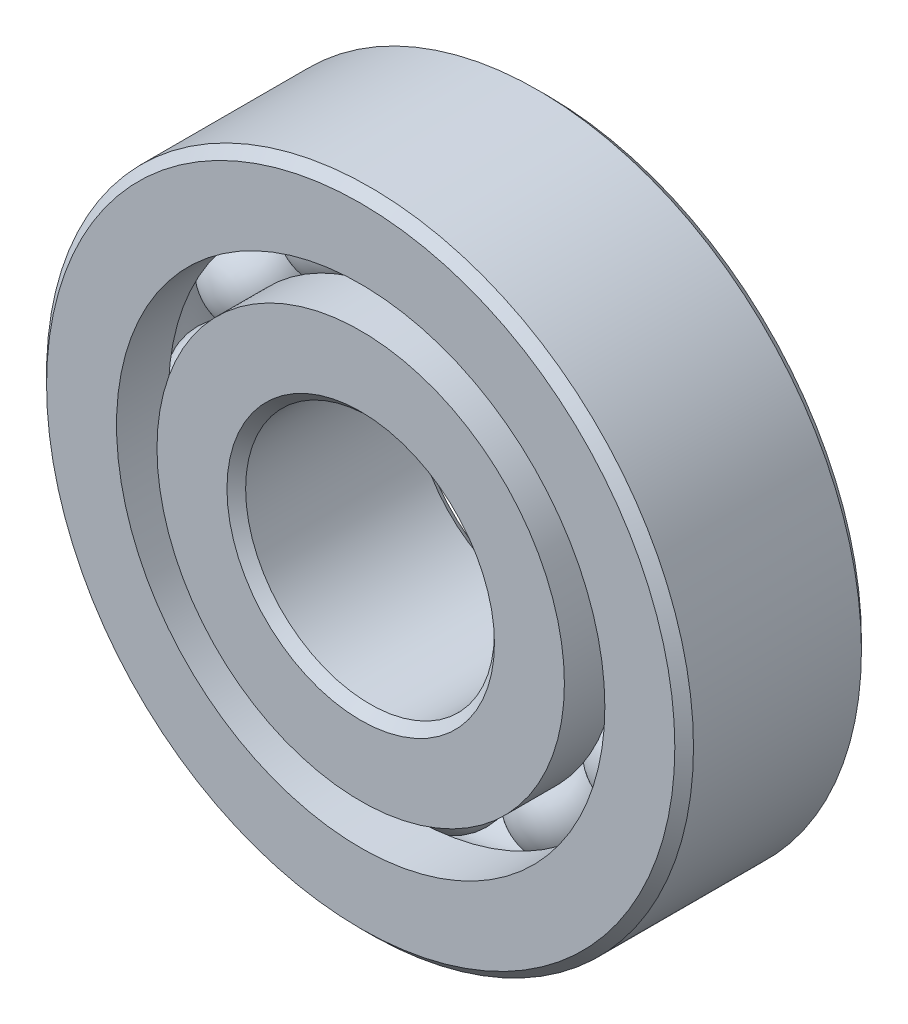
ISO-10303-21;
HEADER;
FILE_DESCRIPTION(('STEP AP214'),'2;1');
FILE_NAME('part.step','',(''),(''),'','','');
FILE_SCHEMA(('AUTOMOTIVE_DESIGN { 1 0 10303 214 1 1 1 1 }'));
ENDSEC;
DATA;
#1=APPLICATION_CONTEXT('core data for automotive mechanical design processes');
#2=APPLICATION_PROTOCOL_DEFINITION('international standard','automotive_design',2000,#1);
#3=PRODUCT_CONTEXT('',#1,'mechanical');
#4=PRODUCT('Part','Part','',(#3));
#5=PRODUCT_RELATED_PRODUCT_CATEGORY('part','',(#4));
#6=PRODUCT_DEFINITION_FORMATION('','',#4);
#7=PRODUCT_DEFINITION_CONTEXT('part definition',#1,'design');
#8=PRODUCT_DEFINITION('design','',#6,#7);
#9=PRODUCT_DEFINITION_SHAPE('','',#8);
#10=(LENGTH_UNIT() NAMED_UNIT(*) SI_UNIT(.MILLI.,.METRE.));
#11=(NAMED_UNIT(*) PLANE_ANGLE_UNIT() SI_UNIT($,.RADIAN.));
#12=(NAMED_UNIT(*) SI_UNIT($,.STERADIAN.) SOLID_ANGLE_UNIT());
#13=UNCERTAINTY_MEASURE_WITH_UNIT(LENGTH_MEASURE(1.E-05),#10,'distance_accuracy_value','');
#14=(GEOMETRIC_REPRESENTATION_CONTEXT(3) GLOBAL_UNCERTAINTY_ASSIGNED_CONTEXT((#13)) GLOBAL_UNIT_ASSIGNED_CONTEXT((#10,
#11,#12)) REPRESENTATION_CONTEXT('',''));
#15=CARTESIAN_POINT('',(0.,0.,0.));
#16=DIRECTION('',(0.,0.,1.));
#17=DIRECTION('',(1.,0.,0.));
#18=AXIS2_PLACEMENT_3D('',#15,#16,#17);
#19=CARTESIAN_POINT('',(-8.9999999999998,15.58845726812,0.));
#20=DIRECTION('',(0.,0.,1.));
#21=DIRECTION('',(-0.499999999999989,0.866025403784445,0.));
#22=AXIS2_PLACEMENT_3D('',#19,#20,#21);
#23=SPHERICAL_SURFACE('',#22,3.70893546501888);
#24=CARTESIAN_POINT('',(-8.9999999999998,15.58845726812,3.70893546501888));
#25=VERTEX_POINT('',#24);
#26=VERTEX_LOOP('',#25);
#27=FACE_BOUND('',#26,.T.);
#28=ADVANCED_FACE('F36',(#27),#23,.T.);
#29=CLOSED_SHELL('',(#28));
#30=MANIFOLD_SOLID_BREP('B2',#29);
#31=CARTESIAN_POINT('',(-15.5884572681198,9.00000000000018,0.));
#32=DIRECTION('',(0.,0.,1.));
#33=DIRECTION('',(-0.866025403784433,0.50000000000001,0.));
#34=AXIS2_PLACEMENT_3D('',#31,#32,#33);
#35=SPHERICAL_SURFACE('',#34,3.70893546501888);
#36=CARTESIAN_POINT('',(-15.5884572681198,9.00000000000018,3.70893546501888));
#37=VERTEX_POINT('',#36);
#38=VERTEX_LOOP('',#37);
#39=FACE_BOUND('',#38,.T.);
#40=ADVANCED_FACE('F57',(#39),#35,.T.);
#41=CLOSED_SHELL('',(#40));
#42=MANIFOLD_SOLID_BREP('B6',#41);
#43=CARTESIAN_POINT('',(-18.,1.88539992297529E-13,0.));
#44=DIRECTION('',(0.,0.,1.));
#45=DIRECTION('',(-1.,0.,0.));
#46=AXIS2_PLACEMENT_3D('',#43,#44,#45);
#47=SPHERICAL_SURFACE('',#46,3.70893546501888);
#48=CARTESIAN_POINT('',(-18.,1.88539992297529E-13,3.70893546501888));
#49=VERTEX_POINT('',#48);
#50=VERTEX_LOOP('',#49);
#51=FACE_BOUND('',#50,.T.);
#52=ADVANCED_FACE('F78',(#51),#47,.T.);
#53=CLOSED_SHELL('',(#52));
#54=MANIFOLD_SOLID_BREP('B32',#53);
#55=CARTESIAN_POINT('',(-15.58845726812,-8.99999999999985,0.));
#56=DIRECTION('',(0.,0.,1.));
#57=DIRECTION('',(-0.866025403784443,-0.499999999999992,0.));
#58=AXIS2_PLACEMENT_3D('',#55,#56,#57);
#59=SPHERICAL_SURFACE('',#58,3.70893546501888);
#60=CARTESIAN_POINT('',(-15.58845726812,-8.99999999999985,3.70893546501888));
#61=VERTEX_POINT('',#60);
#62=VERTEX_LOOP('',#61);
#63=FACE_BOUND('',#62,.T.);
#64=ADVANCED_FACE('F99',(#63),#59,.T.);
#65=CLOSED_SHELL('',(#64));
#66=MANIFOLD_SOLID_BREP('B53',#65);
#67=CARTESIAN_POINT('',(-9.00000000000013,-15.5884572681198,0.));
#68=DIRECTION('',(0.,0.,1.));
#69=DIRECTION('',(-0.500000000000007,-0.866025403784435,0.));
#70=AXIS2_PLACEMENT_3D('',#67,#68,#69);
#71=SPHERICAL_SURFACE('',#70,3.70893546501888);
#72=CARTESIAN_POINT('',(-9.00000000000013,-15.5884572681198,3.70893546501888));
#73=VERTEX_POINT('',#72);
#74=VERTEX_LOOP('',#73);
#75=FACE_BOUND('',#74,.T.);
#76=ADVANCED_FACE('F120',(#75),#71,.T.);
#77=CLOSED_SHELL('',(#76));
#78=MANIFOLD_SOLID_BREP('B74',#77);
#79=CARTESIAN_POINT('',(-1.25693328198353E-13,-18.,0.));
#80=DIRECTION('',(0.,0.,1.));
#81=DIRECTION('',(0.,-1.,0.));
#82=AXIS2_PLACEMENT_3D('',#79,#80,#81);
#83=SPHERICAL_SURFACE('',#82,3.70893546501888);
#84=CARTESIAN_POINT('',(-1.25693328198353E-13,-18.,3.70893546501888));
#85=VERTEX_POINT('',#84);
#86=VERTEX_LOOP('',#85);
#87=FACE_BOUND('',#86,.T.);
#88=ADVANCED_FACE('F141',(#87),#83,.T.);
#89=CLOSED_SHELL('',(#88));
#90=MANIFOLD_SOLID_BREP('B95',#89);
#91=CARTESIAN_POINT('',(8.99999999999991,-15.5884572681199,0.));
#92=DIRECTION('',(0.,0.,1.));
#93=DIRECTION('',(0.499999999999995,-0.866025403784442,0.));
#94=AXIS2_PLACEMENT_3D('',#91,#92,#93);
#95=SPHERICAL_SURFACE('',#94,3.70893546501888);
#96=CARTESIAN_POINT('',(8.99999999999991,-15.5884572681199,3.70893546501888));
#97=VERTEX_POINT('',#96);
#98=VERTEX_LOOP('',#97);
#99=FACE_BOUND('',#98,.T.);
#100=ADVANCED_FACE('F162',(#99),#95,.T.);
#101=CLOSED_SHELL('',(#100));
#102=MANIFOLD_SOLID_BREP('B116',#101);
#103=CARTESIAN_POINT('',(15.5884572681199,-9.00000000000007,0.));
#104=DIRECTION('',(0.,0.,1.));
#105=DIRECTION('',(0.866025403784436,-0.500000000000004,0.));
#106=AXIS2_PLACEMENT_3D('',#103,#104,#105);
#107=SPHERICAL_SURFACE('',#106,3.70893546501888);
#108=CARTESIAN_POINT('',(15.5884572681199,-9.00000000000007,3.70893546501888));
#109=VERTEX_POINT('',#108);
#110=VERTEX_LOOP('',#109);
#111=FACE_BOUND('',#110,.T.);
#112=ADVANCED_FACE('F183',(#111),#107,.T.);
#113=CLOSED_SHELL('',(#112));
#114=MANIFOLD_SOLID_BREP('B137',#113);
#115=CARTESIAN_POINT('',(18.,0.,0.));
#116=DIRECTION('',(0.,0.,1.));
#117=DIRECTION('',(1.,0.,0.));
#118=AXIS2_PLACEMENT_3D('',#115,#116,#117);
#119=SPHERICAL_SURFACE('',#118,3.70893546501888);
#120=CARTESIAN_POINT('',(18.,0.,3.70893546501888));
#121=VERTEX_POINT('',#120);
#122=VERTEX_LOOP('',#121);
#123=FACE_BOUND('',#122,.T.);
#124=ADVANCED_FACE('F204',(#123),#119,.T.);
#125=CLOSED_SHELL('',(#124));
#126=MANIFOLD_SOLID_BREP('B158',#125);
#127=CARTESIAN_POINT('',(15.5884572681199,8.99999999999996,0.));
#128=DIRECTION('',(0.,0.,1.));
#129=DIRECTION('',(0.86602540378444,0.499999999999998,0.));
#130=AXIS2_PLACEMENT_3D('',#127,#128,#129);
#131=SPHERICAL_SURFACE('',#130,3.70893546501888);
#132=CARTESIAN_POINT('',(15.5884572681199,8.99999999999996,3.70893546501888));
#133=VERTEX_POINT('',#132);
#134=VERTEX_LOOP('',#133);
#135=FACE_BOUND('',#134,.T.);
#136=ADVANCED_FACE('F225',(#135),#131,.T.);
#137=CLOSED_SHELL('',(#136));
#138=MANIFOLD_SOLID_BREP('B179',#137);
#139=CARTESIAN_POINT('',(9.00000000000002,15.5884572681199,0.));
#140=DIRECTION('',(0.,0.,1.));
#141=DIRECTION('',(0.500000000000001,0.866025403784438,0.));
#142=AXIS2_PLACEMENT_3D('',#139,#140,#141);
#143=SPHERICAL_SURFACE('',#142,3.70893546501888);
#144=CARTESIAN_POINT('',(9.00000000000002,15.5884572681199,3.70893546501888));
#145=VERTEX_POINT('',#144);
#146=VERTEX_LOOP('',#145);
#147=FACE_BOUND('',#146,.T.);
#148=ADVANCED_FACE('F246',(#147),#143,.T.);
#149=CLOSED_SHELL('',(#148));
#150=MANIFOLD_SOLID_BREP('B200',#149);
#151=CARTESIAN_POINT('',(0.,18.,0.));
#152=DIRECTION('',(0.,0.,1.));
#153=DIRECTION('',(0.,1.,0.));
#154=AXIS2_PLACEMENT_3D('',#151,#152,#153);
#155=SPHERICAL_SURFACE('',#154,3.70893546501888);
#156=CARTESIAN_POINT('',(0.,18.,3.70893546501888));
#157=VERTEX_POINT('',#156);
#158=VERTEX_LOOP('',#157);
#159=FACE_BOUND('',#158,.T.);
#160=ADVANCED_FACE('F269',(#159),#155,.T.);
#161=CLOSED_SHELL('',(#160));
#162=MANIFOLD_SOLID_BREP('B221',#161);
#163=CARTESIAN_POINT('',(0.,16.3736263736264,7.5));
#164=DIRECTION('',(0.,0.,-1.));
#165=DIRECTION('',(-1.,0.,0.));
#166=AXIS2_PLACEMENT_3D('',#163,#164,#165);
#167=PLANE('',#166);
#168=CARTESIAN_POINT('',(0.,0.,7.5));
#169=DIRECTION('',(0.,0.,1.));
#170=DIRECTION('',(1.,0.,0.));
#171=AXIS2_PLACEMENT_3D('',#168,#169,#170);
#172=CIRCLE('',#171,10.75);
#173=CARTESIAN_POINT('',(10.75,0.,7.5));
#174=VERTEX_POINT('',#173);
#175=EDGE_CURVE('E317',#174,#174,#172,.T.);
#176=ORIENTED_EDGE('',*,*,#175,.F.);
#177=EDGE_LOOP('',(#176));
#178=FACE_BOUND('',#177,.T.);
#179=CARTESIAN_POINT('',(0.,0.,7.5));
#180=DIRECTION('',(0.,0.,1.));
#181=DIRECTION('',(1.,0.,0.));
#182=AXIS2_PLACEMENT_3D('',#179,#180,#181);
#183=CIRCLE('',#182,16.3736263736264);
#184=CARTESIAN_POINT('',(16.3736263736264,0.,7.5));
#185=VERTEX_POINT('',#184);
#186=EDGE_CURVE('E268',#185,#185,#183,.T.);
#187=ORIENTED_EDGE('',*,*,#186,.T.);
#188=EDGE_LOOP('',(#187));
#189=FACE_BOUND('',#188,.T.);
#190=ADVANCED_FACE('F289',(#178,#189),#167,.F.);
#191=CARTESIAN_POINT('',(0.,0.,7.5));
#192=DIRECTION('',(0.,0.,1.));
#193=DIRECTION('',(1.,0.,0.));
#194=AXIS2_PLACEMENT_3D('',#191,#192,#193);
#195=CYLINDRICAL_SURFACE('',#194,16.3736263736264);
#196=ORIENTED_EDGE('',*,*,#186,.F.);
#197=EDGE_LOOP('',(#196));
#198=FACE_BOUND('',#197,.T.);
#199=CARTESIAN_POINT('',(0.,0.,3.33333333333333));
#200=DIRECTION('',(0.,0.,1.));
#201=DIRECTION('',(1.,0.,0.));
#202=AXIS2_PLACEMENT_3D('',#199,#200,#201);
#203=CIRCLE('',#202,16.3736263736264);
#204=CARTESIAN_POINT('',(16.3736263736264,0.,3.33333333333333));
#205=VERTEX_POINT('',#204);
#206=EDGE_CURVE('E295',#205,#205,#203,.T.);
#207=ORIENTED_EDGE('',*,*,#206,.T.);
#208=EDGE_LOOP('',(#207));
#209=FACE_BOUND('',#208,.T.);
#210=ADVANCED_FACE('F324',(#198,#209),#195,.T.);
#211=CARTESIAN_POINT('',(0.,0.,0.));
#212=DIRECTION('',(0.,0.,1.));
#213=DIRECTION('',(1.,0.,0.));
#214=AXIS2_PLACEMENT_3D('',#211,#212,#213);
#215=TOROIDAL_SURFACE('',#214,18.,3.70893546501887);
#216=ORIENTED_EDGE('',*,*,#206,.F.);
#217=EDGE_LOOP('',(#216));
#218=FACE_BOUND('',#217,.T.);
#219=CARTESIAN_POINT('',(0.,0.,-3.33333333333334));
#220=DIRECTION('',(0.,0.,1.));
#221=DIRECTION('',(1.,0.,0.));
#222=AXIS2_PLACEMENT_3D('',#219,#220,#221);
#223=CIRCLE('',#222,16.3736263736264);
#224=CARTESIAN_POINT('',(16.3736263736264,0.,-3.33333333333334));
#225=VERTEX_POINT('',#224);
#226=EDGE_CURVE('E299',#225,#225,#223,.T.);
#227=ORIENTED_EDGE('',*,*,#226,.T.);
#228=EDGE_LOOP('',(#227));
#229=FACE_BOUND('',#228,.T.);
#230=ADVANCED_FACE('F328',(#218,#229),#215,.F.);
#231=CARTESIAN_POINT('',(0.,0.,7.5));
#232=DIRECTION('',(0.,0.,1.));
#233=DIRECTION('',(1.,0.,0.));
#234=AXIS2_PLACEMENT_3D('',#231,#232,#233);
#235=CYLINDRICAL_SURFACE('',#234,16.3736263736264);
#236=ORIENTED_EDGE('',*,*,#226,.F.);
#237=EDGE_LOOP('',(#236));
#238=FACE_BOUND('',#237,.T.);
#239=CARTESIAN_POINT('',(0.,0.,-7.5));
#240=DIRECTION('',(0.,0.,1.));
#241=DIRECTION('',(1.,0.,0.));
#242=AXIS2_PLACEMENT_3D('',#239,#240,#241);
#243=CIRCLE('',#242,16.3736263736264);
#244=CARTESIAN_POINT('',(16.3736263736264,0.,-7.5));
#245=VERTEX_POINT('',#244);
#246=EDGE_CURVE('E303',#245,#245,#243,.T.);
#247=ORIENTED_EDGE('',*,*,#246,.T.);
#248=EDGE_LOOP('',(#247));
#249=FACE_BOUND('',#248,.T.);
#250=ADVANCED_FACE('F333',(#238,#249),#235,.T.);
#251=CARTESIAN_POINT('',(0.,10.75,-7.5));
#252=DIRECTION('',(0.,0.,1.));
#253=DIRECTION('',(1.,0.,0.));
#254=AXIS2_PLACEMENT_3D('',#251,#252,#253);
#255=PLANE('',#254);
#256=ORIENTED_EDGE('',*,*,#246,.F.);
#257=EDGE_LOOP('',(#256));
#258=FACE_BOUND('',#257,.T.);
#259=CARTESIAN_POINT('',(0.,0.,-7.5));
#260=DIRECTION('',(0.,0.,1.));
#261=DIRECTION('',(1.,0.,0.));
#262=AXIS2_PLACEMENT_3D('',#259,#260,#261);
#263=CIRCLE('',#262,10.75);
#264=CARTESIAN_POINT('',(10.75,0.,-7.5));
#265=VERTEX_POINT('',#264);
#266=EDGE_CURVE('E308',#265,#265,#263,.T.);
#267=ORIENTED_EDGE('',*,*,#266,.T.);
#268=EDGE_LOOP('',(#267));
#269=FACE_BOUND('',#268,.T.);
#270=ADVANCED_FACE('F339',(#258,#269),#255,.F.);
#271=CARTESIAN_POINT('',(0.,0.,-6.75));
#272=DIRECTION('',(0.,0.,-1.));
#273=DIRECTION('',(-1.,0.,0.));
#274=AXIS2_PLACEMENT_3D('',#271,#272,#273);
#275=CONICAL_SURFACE('',#274,10.,0.785398163397445);
#276=ORIENTED_EDGE('',*,*,#266,.F.);
#277=EDGE_LOOP('',(#276));
#278=FACE_BOUND('',#277,.T.);
#279=CARTESIAN_POINT('',(0.,0.,-6.75));
#280=DIRECTION('',(0.,0.,1.));
#281=DIRECTION('',(1.,0.,0.));
#282=AXIS2_PLACEMENT_3D('',#279,#280,#281);
#283=CIRCLE('',#282,10.);
#284=CARTESIAN_POINT('',(10.,0.,-6.75));
#285=VERTEX_POINT('',#284);
#286=EDGE_CURVE('E311',#285,#285,#283,.T.);
#287=ORIENTED_EDGE('',*,*,#286,.T.);
#288=EDGE_LOOP('',(#287));
#289=FACE_BOUND('',#288,.T.);
#290=ADVANCED_FACE('F343',(#278,#289),#275,.F.);
#291=CARTESIAN_POINT('',(0.,0.,7.5));
#292=DIRECTION('',(0.,0.,1.));
#293=DIRECTION('',(1.,0.,0.));
#294=AXIS2_PLACEMENT_3D('',#291,#292,#293);
#295=CYLINDRICAL_SURFACE('',#294,10.);
#296=ORIENTED_EDGE('',*,*,#286,.F.);
#297=EDGE_LOOP('',(#296));
#298=FACE_BOUND('',#297,.T.);
#299=CARTESIAN_POINT('',(0.,0.,6.75000000000001));
#300=DIRECTION('',(0.,0.,1.));
#301=DIRECTION('',(1.,0.,0.));
#302=AXIS2_PLACEMENT_3D('',#299,#300,#301);
#303=CIRCLE('',#302,10.);
#304=CARTESIAN_POINT('',(10.,0.,6.75000000000001));
#305=VERTEX_POINT('',#304);
#306=EDGE_CURVE('E314',#305,#305,#303,.T.);
#307=ORIENTED_EDGE('',*,*,#306,.T.);
#308=EDGE_LOOP('',(#307));
#309=FACE_BOUND('',#308,.T.);
#310=ADVANCED_FACE('F347',(#298,#309),#295,.F.);
#311=CARTESIAN_POINT('',(0.,0.,7.5));
#312=DIRECTION('',(0.,0.,1.));
#313=DIRECTION('',(1.,0.,0.));
#314=AXIS2_PLACEMENT_3D('',#311,#312,#313);
#315=CONICAL_SURFACE('',#314,10.75,0.785398163397453);
#316=ORIENTED_EDGE('',*,*,#306,.F.);
#317=EDGE_LOOP('',(#316));
#318=FACE_BOUND('',#317,.T.);
#319=ORIENTED_EDGE('',*,*,#175,.T.);
#320=EDGE_LOOP('',(#319));
#321=FACE_BOUND('',#320,.T.);
#322=ADVANCED_FACE('F321',(#318,#321),#315,.F.);
#323=CLOSED_SHELL('',(#190,#210,#230,#250,#270,#290,#310,#322));
#324=MANIFOLD_SOLID_BREP('B242',#323);
#325=CARTESIAN_POINT('',(0.,0.,6.75));
#326=DIRECTION('',(0.,0.,-1.));
#327=DIRECTION('',(-1.,0.,0.));
#328=AXIS2_PLACEMENT_3D('',#325,#326,#327);
#329=CONICAL_SURFACE('',#328,26.,0.785398163397447);
#330=CARTESIAN_POINT('',(0.,0.,7.5));
#331=DIRECTION('',(0.,0.,1.));
#332=DIRECTION('',(1.,0.,0.));
#333=AXIS2_PLACEMENT_3D('',#330,#331,#332);
#334=CIRCLE('',#333,25.25);
#335=CARTESIAN_POINT('',(25.25,0.,7.5));
#336=VERTEX_POINT('',#335);
#337=EDGE_CURVE('E439',#336,#336,#334,.T.);
#338=ORIENTED_EDGE('',*,*,#337,.F.);
#339=EDGE_LOOP('',(#338));
#340=FACE_BOUND('',#339,.T.);
#341=CARTESIAN_POINT('',(0.,0.,6.75));
#342=DIRECTION('',(0.,0.,1.));
#343=DIRECTION('',(1.,0.,0.));
#344=AXIS2_PLACEMENT_3D('',#341,#342,#343);
#345=CIRCLE('',#344,26.);
#346=CARTESIAN_POINT('',(26.,0.,6.75));
#347=VERTEX_POINT('',#346);
#348=EDGE_CURVE('E288',#347,#347,#345,.T.);
#349=ORIENTED_EDGE('',*,*,#348,.T.);
#350=EDGE_LOOP('',(#349));
#351=FACE_BOUND('',#350,.T.);
#352=ADVANCED_FACE('F411',(#340,#351),#329,.T.);
#353=CARTESIAN_POINT('',(0.,0.,7.5));
#354=DIRECTION('',(0.,0.,1.));
#355=DIRECTION('',(1.,0.,0.));
#356=AXIS2_PLACEMENT_3D('',#353,#354,#355);
#357=CYLINDRICAL_SURFACE('',#356,26.);
#358=ORIENTED_EDGE('',*,*,#348,.F.);
#359=EDGE_LOOP('',(#358));
#360=FACE_BOUND('',#359,.T.);
#361=CARTESIAN_POINT('',(0.,0.,-6.75));
#362=DIRECTION('',(0.,0.,1.));
#363=DIRECTION('',(1.,0.,0.));
#364=AXIS2_PLACEMENT_3D('',#361,#362,#363);
#365=CIRCLE('',#364,26.);
#366=CARTESIAN_POINT('',(26.,0.,-6.75));
#367=VERTEX_POINT('',#366);
#368=EDGE_CURVE('E417',#367,#367,#365,.T.);
#369=ORIENTED_EDGE('',*,*,#368,.T.);
#370=EDGE_LOOP('',(#369));
#371=FACE_BOUND('',#370,.T.);
#372=ADVANCED_FACE('F446',(#360,#371),#357,.T.);
#373=CARTESIAN_POINT('',(0.,0.,-7.5));
#374=DIRECTION('',(0.,0.,1.));
#375=DIRECTION('',(1.,0.,0.));
#376=AXIS2_PLACEMENT_3D('',#373,#374,#375);
#377=CONICAL_SURFACE('',#376,25.25,0.785398163397446);
#378=ORIENTED_EDGE('',*,*,#368,.F.);
#379=EDGE_LOOP('',(#378));
#380=FACE_BOUND('',#379,.T.);
#381=CARTESIAN_POINT('',(0.,0.,-7.5));
#382=DIRECTION('',(0.,0.,1.));
#383=DIRECTION('',(1.,0.,0.));
#384=AXIS2_PLACEMENT_3D('',#381,#382,#383);
#385=CIRCLE('',#384,25.25);
#386=CARTESIAN_POINT('',(25.25,0.,-7.5));
#387=VERTEX_POINT('',#386);
#388=EDGE_CURVE('E421',#387,#387,#385,.T.);
#389=ORIENTED_EDGE('',*,*,#388,.T.);
#390=EDGE_LOOP('',(#389));
#391=FACE_BOUND('',#390,.T.);
#392=ADVANCED_FACE('F450',(#380,#391),#377,.T.);
#393=CARTESIAN_POINT('',(0.,25.25,-7.5));
#394=DIRECTION('',(0.,0.,1.));
#395=DIRECTION('',(1.,0.,0.));
#396=AXIS2_PLACEMENT_3D('',#393,#394,#395);
#397=PLANE('',#396);
#398=ORIENTED_EDGE('',*,*,#388,.F.);
#399=EDGE_LOOP('',(#398));
#400=FACE_BOUND('',#399,.T.);
#401=CARTESIAN_POINT('',(0.,0.,-7.50000000000001));
#402=DIRECTION('',(0.,0.,1.));
#403=DIRECTION('',(1.,0.,0.));
#404=AXIS2_PLACEMENT_3D('',#401,#402,#403);
#405=CIRCLE('',#404,19.6263736263736);
#406=CARTESIAN_POINT('',(19.6263736263736,0.,-7.50000000000001));
#407=VERTEX_POINT('',#406);
#408=EDGE_CURVE('E425',#407,#407,#405,.T.);
#409=ORIENTED_EDGE('',*,*,#408,.T.);
#410=EDGE_LOOP('',(#409));
#411=FACE_BOUND('',#410,.T.);
#412=ADVANCED_FACE('F455',(#400,#411),#397,.F.);
#413=CARTESIAN_POINT('',(0.,0.,7.5));
#414=DIRECTION('',(0.,0.,1.));
#415=DIRECTION('',(1.,0.,0.));
#416=AXIS2_PLACEMENT_3D('',#413,#414,#415);
#417=CYLINDRICAL_SURFACE('',#416,19.6263736263736);
#418=ORIENTED_EDGE('',*,*,#408,.F.);
#419=EDGE_LOOP('',(#418));
#420=FACE_BOUND('',#419,.T.);
#421=CARTESIAN_POINT('',(0.,0.,-3.33333333333333));
#422=DIRECTION('',(0.,0.,1.));
#423=DIRECTION('',(1.,0.,0.));
#424=AXIS2_PLACEMENT_3D('',#421,#422,#423);
#425=CIRCLE('',#424,19.6263736263736);
#426=CARTESIAN_POINT('',(19.6263736263736,0.,-3.33333333333333));
#427=VERTEX_POINT('',#426);
#428=EDGE_CURVE('E430',#427,#427,#425,.T.);
#429=ORIENTED_EDGE('',*,*,#428,.T.);
#430=EDGE_LOOP('',(#429));
#431=FACE_BOUND('',#430,.T.);
#432=ADVANCED_FACE('F461',(#420,#431),#417,.F.);
#433=CARTESIAN_POINT('',(0.,0.,0.));
#434=DIRECTION('',(0.,0.,1.));
#435=DIRECTION('',(1.,0.,0.));
#436=AXIS2_PLACEMENT_3D('',#433,#434,#435);
#437=TOROIDAL_SURFACE('',#436,18.,3.70893546501888);
#438=ORIENTED_EDGE('',*,*,#428,.F.);
#439=EDGE_LOOP('',(#438));
#440=FACE_BOUND('',#439,.T.);
#441=CARTESIAN_POINT('',(0.,0.,3.33333333333333));
#442=DIRECTION('',(0.,0.,1.));
#443=DIRECTION('',(1.,0.,0.));
#444=AXIS2_PLACEMENT_3D('',#441,#442,#443);
#445=CIRCLE('',#444,19.6263736263736);
#446=CARTESIAN_POINT('',(19.6263736263736,0.,3.33333333333333));
#447=VERTEX_POINT('',#446);
#448=EDGE_CURVE('E433',#447,#447,#445,.T.);
#449=ORIENTED_EDGE('',*,*,#448,.T.);
#450=EDGE_LOOP('',(#449));
#451=FACE_BOUND('',#450,.T.);
#452=ADVANCED_FACE('F465',(#440,#451),#437,.F.);
#453=CARTESIAN_POINT('',(0.,0.,7.5));
#454=DIRECTION('',(0.,0.,1.));
#455=DIRECTION('',(1.,0.,0.));
#456=AXIS2_PLACEMENT_3D('',#453,#454,#455);
#457=CYLINDRICAL_SURFACE('',#456,19.6263736263736);
#458=ORIENTED_EDGE('',*,*,#448,.F.);
#459=EDGE_LOOP('',(#458));
#460=FACE_BOUND('',#459,.T.);
#461=CARTESIAN_POINT('',(0.,0.,7.5));
#462=DIRECTION('',(0.,0.,1.));
#463=DIRECTION('',(1.,0.,0.));
#464=AXIS2_PLACEMENT_3D('',#461,#462,#463);
#465=CIRCLE('',#464,19.6263736263736);
#466=CARTESIAN_POINT('',(19.6263736263736,0.,7.5));
#467=VERTEX_POINT('',#466);
#468=EDGE_CURVE('E436',#467,#467,#465,.T.);
#469=ORIENTED_EDGE('',*,*,#468,.T.);
#470=EDGE_LOOP('',(#469));
#471=FACE_BOUND('',#470,.T.);
#472=ADVANCED_FACE('F469',(#460,#471),#457,.F.);
#473=CARTESIAN_POINT('',(0.,25.25,7.5));
#474=DIRECTION('',(0.,0.,-1.));
#475=DIRECTION('',(-1.,0.,0.));
#476=AXIS2_PLACEMENT_3D('',#473,#474,#475);
#477=PLANE('',#476);
#478=ORIENTED_EDGE('',*,*,#468,.F.);
#479=EDGE_LOOP('',(#478));
#480=FACE_BOUND('',#479,.T.);
#481=ORIENTED_EDGE('',*,*,#337,.T.);
#482=EDGE_LOOP('',(#481));
#483=FACE_BOUND('',#482,.T.);
#484=ADVANCED_FACE('F443',(#480,#483),#477,.F.);
#485=CLOSED_SHELL('',(#352,#372,#392,#412,#432,#452,#472,#484));
#486=MANIFOLD_SOLID_BREP('B263',#485);
#487=ADVANCED_BREP_SHAPE_REPRESENTATION('',(#18,#30,#42,#54,#66,#78,#90,#102,#114,#126,#138,
#150,#162,#324,#486),#14);
#488=SHAPE_DEFINITION_REPRESENTATION(#9,#487);
ENDSEC;
END-ISO-10303-21;
